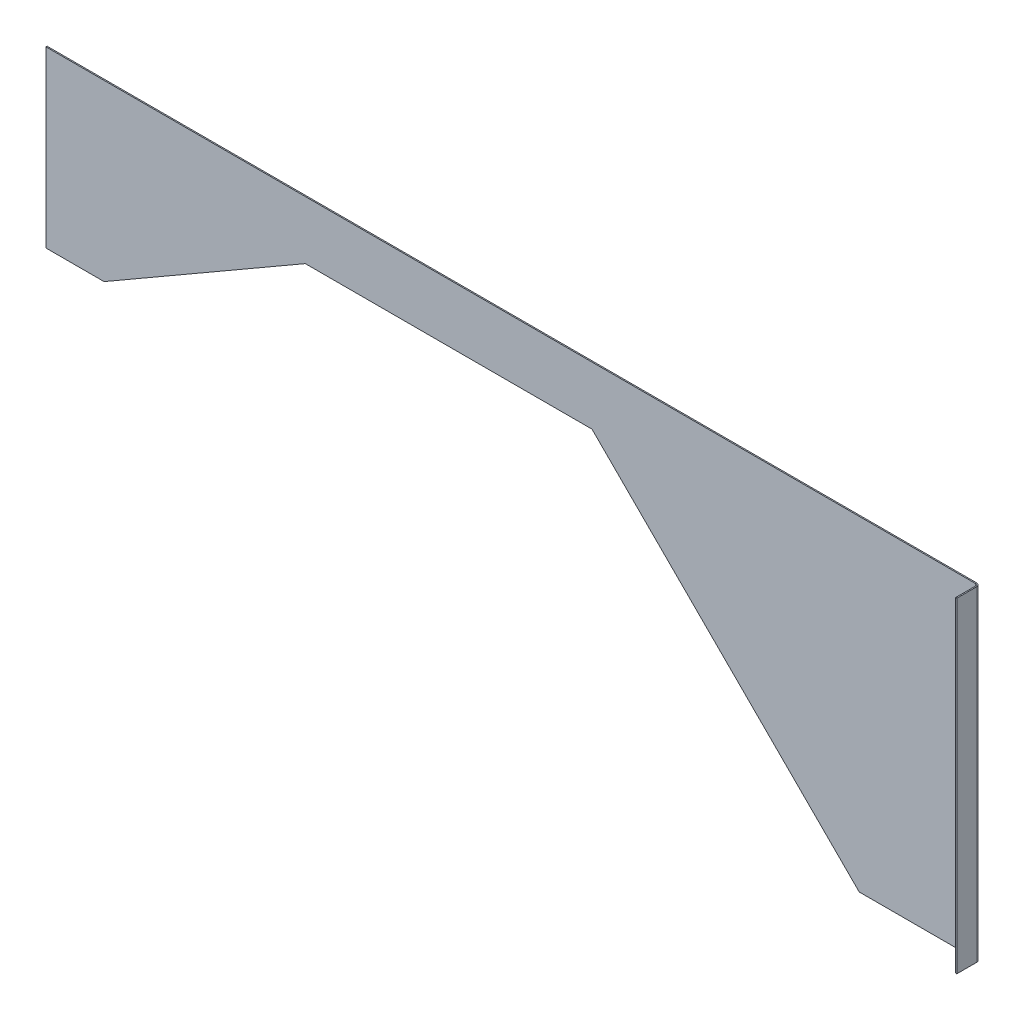
ISO-10303-21;
HEADER;
FILE_DESCRIPTION(('STEP AP214'),'2;1');
FILE_NAME('part.step','',(''),(''),'','','');
FILE_SCHEMA(('AUTOMOTIVE_DESIGN { 1 0 10303 214 1 1 1 1 }'));
ENDSEC;
DATA;
#1=APPLICATION_CONTEXT('core data for automotive mechanical design processes');
#2=APPLICATION_PROTOCOL_DEFINITION('international standard','automotive_design',2000,#1);
#3=PRODUCT_CONTEXT('',#1,'mechanical');
#4=PRODUCT('Part','Part','',(#3));
#5=PRODUCT_RELATED_PRODUCT_CATEGORY('part','',(#4));
#6=PRODUCT_DEFINITION_FORMATION('','',#4);
#7=PRODUCT_DEFINITION_CONTEXT('part definition',#1,'design');
#8=PRODUCT_DEFINITION('design','',#6,#7);
#9=PRODUCT_DEFINITION_SHAPE('','',#8);
#10=(LENGTH_UNIT() NAMED_UNIT(*) SI_UNIT(.MILLI.,.METRE.));
#11=(NAMED_UNIT(*) PLANE_ANGLE_UNIT() SI_UNIT($,.RADIAN.));
#12=(NAMED_UNIT(*) SI_UNIT($,.STERADIAN.) SOLID_ANGLE_UNIT());
#13=UNCERTAINTY_MEASURE_WITH_UNIT(LENGTH_MEASURE(1.E-05),#10,'distance_accuracy_value','');
#14=(GEOMETRIC_REPRESENTATION_CONTEXT(3) GLOBAL_UNCERTAINTY_ASSIGNED_CONTEXT((#13)) GLOBAL_UNIT_ASSIGNED_CONTEXT((#10,
#11,#12)) REPRESENTATION_CONTEXT('',''));
#15=CARTESIAN_POINT('',(0.,0.,0.));
#16=DIRECTION('',(0.,0.,1.));
#17=DIRECTION('',(1.,0.,0.));
#18=AXIS2_PLACEMENT_3D('',#15,#16,#17);
#19=CARTESIAN_POINT('',(-470.000000000001,-100.,1.));
#20=DIRECTION('',(0.,-1.,0.));
#21=DIRECTION('',(1.,0.,0.));
#22=AXIS2_PLACEMENT_3D('',#19,#20,#21);
#23=PLANE('',#22);
#24=DIRECTION('',(0.,0.,1.));
#25=VECTOR('',#24,1.);
#26=CARTESIAN_POINT('',(-470.000000000001,-100.,1.));
#27=LINE('',#26,#25);
#28=CARTESIAN_POINT('',(-470.000000000001,-100.,1.));
#29=VERTEX_POINT('',#28);
#30=CARTESIAN_POINT('',(-470.000000000001,-100.,2.));
#31=VERTEX_POINT('',#30);
#32=EDGE_CURVE('E13',#29,#31,#27,.T.);
#33=ORIENTED_EDGE('',*,*,#32,.F.);
#34=DIRECTION('',(1.,0.,0.));
#35=VECTOR('',#34,1.);
#36=CARTESIAN_POINT('',(-470.000000000001,-100.,1.));
#37=LINE('',#36,#35);
#38=CARTESIAN_POINT('',(-420.000000000001,-100.,1.));
#39=VERTEX_POINT('',#38);
#40=EDGE_CURVE('E198',#29,#39,#37,.T.);
#41=ORIENTED_EDGE('',*,*,#40,.T.);
#42=DIRECTION('',(0.,0.,1.));
#43=VECTOR('',#42,1.);
#44=CARTESIAN_POINT('',(-420.000000000001,-100.,1.));
#45=LINE('',#44,#43);
#46=CARTESIAN_POINT('',(-420.000000000001,-100.,2.));
#47=VERTEX_POINT('',#46);
#48=EDGE_CURVE('E69',#39,#47,#45,.T.);
#49=ORIENTED_EDGE('',*,*,#48,.T.);
#50=DIRECTION('',(1.,0.,0.));
#51=VECTOR('',#50,1.);
#52=CARTESIAN_POINT('',(0.,-100.,2.));
#53=LINE('',#52,#51);
#54=EDGE_CURVE('E191',#31,#47,#53,.T.);
#55=ORIENTED_EDGE('',*,*,#54,.F.);
#56=EDGE_LOOP('',(#33,#41,#49,#55));
#57=FACE_BOUND('',#56,.T.);
#58=ADVANCED_FACE('F59',(#57),#23,.T.);
#59=CARTESIAN_POINT('',(-420.000000000001,-100.,1.));
#60=DIRECTION('',(0.500000000000002,-0.866025403784438,0.));
#61=DIRECTION('',(0.866025403784438,0.500000000000001,0.));
#62=AXIS2_PLACEMENT_3D('',#59,#60,#61);
#63=PLANE('',#62);
#64=ORIENTED_EDGE('',*,*,#48,.F.);
#65=DIRECTION('',(0.866025403784438,0.500000000000001,0.));
#66=VECTOR('',#65,1.);
#67=CARTESIAN_POINT('',(-420.000000000001,-100.,1.));
#68=LINE('',#67,#66);
#69=CARTESIAN_POINT('',(-246.794919243114,0.,1.));
#70=VERTEX_POINT('',#69);
#71=EDGE_CURVE('E201',#39,#70,#68,.T.);
#72=ORIENTED_EDGE('',*,*,#71,.T.);
#73=DIRECTION('',(0.,0.,1.));
#74=VECTOR('',#73,1.);
#75=CARTESIAN_POINT('',(-246.794919243114,0.,1.));
#76=LINE('',#75,#74);
#77=CARTESIAN_POINT('',(-246.794919243114,0.,2.));
#78=VERTEX_POINT('',#77);
#79=EDGE_CURVE('E213',#70,#78,#76,.T.);
#80=ORIENTED_EDGE('',*,*,#79,.T.);
#81=DIRECTION('',(0.866025403784438,0.500000000000001,0.));
#82=VECTOR('',#81,1.);
#83=CARTESIAN_POINT('',(-420.000000000001,-100.,2.));
#84=LINE('',#83,#82);
#85=EDGE_CURVE('E188',#47,#78,#84,.T.);
#86=ORIENTED_EDGE('',*,*,#85,.F.);
#87=EDGE_LOOP('',(#64,#72,#80,#86));
#88=FACE_BOUND('',#87,.T.);
#89=ADVANCED_FACE('F225',(#88),#63,.T.);
#90=CARTESIAN_POINT('',(-246.794919243114,0.,1.));
#91=DIRECTION('',(0.,-1.,0.));
#92=DIRECTION('',(1.,0.,0.));
#93=AXIS2_PLACEMENT_3D('',#90,#91,#92);
#94=PLANE('',#93);
#95=ORIENTED_EDGE('',*,*,#79,.F.);
#96=DIRECTION('',(1.,0.,0.));
#97=VECTOR('',#96,1.);
#98=CARTESIAN_POINT('',(-246.794919243114,0.,1.));
#99=LINE('',#98,#97);
#100=CARTESIAN_POINT('',(0.,0.,1.));
#101=VERTEX_POINT('',#100);
#102=EDGE_CURVE('E204',#70,#101,#99,.T.);
#103=ORIENTED_EDGE('',*,*,#102,.T.);
#104=DIRECTION('',(0.,0.,1.));
#105=VECTOR('',#104,1.);
#106=CARTESIAN_POINT('',(0.,0.,1.));
#107=LINE('',#106,#105);
#108=CARTESIAN_POINT('',(0.,0.,2.));
#109=VERTEX_POINT('',#108);
#110=EDGE_CURVE('E211',#101,#109,#107,.T.);
#111=ORIENTED_EDGE('',*,*,#110,.T.);
#112=DIRECTION('',(1.,0.,0.));
#113=VECTOR('',#112,1.);
#114=CARTESIAN_POINT('',(0.,0.,2.));
#115=LINE('',#114,#113);
#116=EDGE_CURVE('E185',#78,#109,#115,.T.);
#117=ORIENTED_EDGE('',*,*,#116,.F.);
#118=EDGE_LOOP('',(#95,#103,#111,#117));
#119=FACE_BOUND('',#118,.T.);
#120=ADVANCED_FACE('F228',(#119),#94,.T.);
#121=CARTESIAN_POINT('',(0.,0.,1.));
#122=DIRECTION('',(-0.707106781186549,-0.707106781186546,0.));
#123=DIRECTION('',(0.707106781186546,-0.707106781186549,0.));
#124=AXIS2_PLACEMENT_3D('',#121,#122,#123);
#125=PLANE('',#124);
#126=ORIENTED_EDGE('',*,*,#110,.F.);
#127=DIRECTION('',(0.707106781186546,-0.707106781186549,0.));
#128=VECTOR('',#127,1.);
#129=CARTESIAN_POINT('',(0.,0.,1.));
#130=LINE('',#129,#128);
#131=CARTESIAN_POINT('',(229.999999999999,-230.,1.));
#132=VERTEX_POINT('',#131);
#133=EDGE_CURVE('E133',#101,#132,#130,.T.);
#134=ORIENTED_EDGE('',*,*,#133,.T.);
#135=DIRECTION('',(0.,0.,1.));
#136=VECTOR('',#135,1.);
#137=CARTESIAN_POINT('',(229.999999999999,-230.,1.));
#138=LINE('',#137,#136);
#139=CARTESIAN_POINT('',(229.999999999999,-230.,2.));
#140=VERTEX_POINT('',#139);
#141=EDGE_CURVE('E121',#132,#140,#138,.T.);
#142=ORIENTED_EDGE('',*,*,#141,.T.);
#143=DIRECTION('',(0.707106781186546,-0.707106781186549,0.));
#144=VECTOR('',#143,1.);
#145=CARTESIAN_POINT('',(0.,0.,2.));
#146=LINE('',#145,#144);
#147=EDGE_CURVE('E182',#109,#140,#146,.T.);
#148=ORIENTED_EDGE('',*,*,#147,.F.);
#149=EDGE_LOOP('',(#126,#134,#142,#148));
#150=FACE_BOUND('',#149,.T.);
#151=ADVANCED_FACE('F230',(#150),#125,.T.);
#152=CARTESIAN_POINT('',(229.999999999999,-230.,1.));
#153=DIRECTION('',(0.,-1.,0.));
#154=DIRECTION('',(1.,0.,0.));
#155=AXIS2_PLACEMENT_3D('',#152,#153,#154);
#156=PLANE('',#155);
#157=ORIENTED_EDGE('',*,*,#141,.F.);
#158=DIRECTION('',(1.,0.,0.));
#159=VECTOR('',#158,1.);
#160=CARTESIAN_POINT('',(229.999999999999,-230.,1.));
#161=LINE('',#160,#159);
#162=CARTESIAN_POINT('',(329.999999999999,-230.,1.));
#163=VERTEX_POINT('',#162);
#164=EDGE_CURVE('E123',#132,#163,#161,.T.);
#165=ORIENTED_EDGE('',*,*,#164,.T.);
#166=DIRECTION('',(0.,0.,1.));
#167=VECTOR('',#166,1.);
#168=CARTESIAN_POINT('',(329.999999999999,-230.,1.));
#169=LINE('',#168,#167);
#170=CARTESIAN_POINT('',(329.999999999999,-230.,2.));
#171=VERTEX_POINT('',#170);
#172=EDGE_CURVE('E127',#163,#171,#169,.T.);
#173=ORIENTED_EDGE('',*,*,#172,.T.);
#174=DIRECTION('',(1.,0.,0.));
#175=VECTOR('',#174,1.);
#176=CARTESIAN_POINT('',(0.,-230.,2.));
#177=LINE('',#176,#175);
#178=EDGE_CURVE('E180',#140,#171,#177,.T.);
#179=ORIENTED_EDGE('',*,*,#178,.F.);
#180=EDGE_LOOP('',(#157,#165,#173,#179));
#181=FACE_BOUND('',#180,.T.);
#182=ADVANCED_FACE('F125',(#181),#156,.T.);
#183=CARTESIAN_POINT('',(329.999999999999,50.,1.));
#184=DIRECTION('',(0.,1.,0.));
#185=DIRECTION('',(-1.,0.,0.));
#186=AXIS2_PLACEMENT_3D('',#183,#184,#185);
#187=PLANE('',#186);
#188=DIRECTION('',(0.,0.,1.));
#189=VECTOR('',#188,1.);
#190=CARTESIAN_POINT('',(329.999999999999,50.,1.));
#191=LINE('',#190,#189);
#192=CARTESIAN_POINT('',(329.999999999999,50.,1.00000000000001));
#193=VERTEX_POINT('',#192);
#194=CARTESIAN_POINT('',(329.999999999999,50.,2.));
#195=VERTEX_POINT('',#194);
#196=EDGE_CURVE('E156',#193,#195,#191,.T.);
#197=ORIENTED_EDGE('',*,*,#196,.F.);
#198=DIRECTION('',(-1.,0.,0.));
#199=VECTOR('',#198,1.);
#200=CARTESIAN_POINT('',(329.999999999999,50.,1.));
#201=LINE('',#200,#199);
#202=CARTESIAN_POINT('',(-470.000000000001,49.9999999999999,1.));
#203=VERTEX_POINT('',#202);
#204=EDGE_CURVE('E140',#193,#203,#201,.T.);
#205=ORIENTED_EDGE('',*,*,#204,.T.);
#206=DIRECTION('',(0.,0.,1.));
#207=VECTOR('',#206,1.);
#208=CARTESIAN_POINT('',(-470.000000000001,49.9999999999999,1.));
#209=LINE('',#208,#207);
#210=CARTESIAN_POINT('',(-470.000000000001,49.9999999999999,2.));
#211=VERTEX_POINT('',#210);
#212=EDGE_CURVE('E63',#203,#211,#209,.T.);
#213=ORIENTED_EDGE('',*,*,#212,.T.);
#214=DIRECTION('',(1.,0.,0.));
#215=VECTOR('',#214,1.);
#216=CARTESIAN_POINT('',(0.,50.,2.));
#217=LINE('',#216,#215);
#218=EDGE_CURVE('E77',#195,#211,#217,.F.);
#219=ORIENTED_EDGE('',*,*,#218,.F.);
#220=EDGE_LOOP('',(#197,#205,#213,#219));
#221=FACE_BOUND('',#220,.T.);
#222=ADVANCED_FACE('F319',(#221),#187,.T.);
#223=CARTESIAN_POINT('',(-470.000000000001,49.9999999999999,1.));
#224=DIRECTION('',(-1.,0.,0.));
#225=DIRECTION('',(0.,-1.,0.));
#226=AXIS2_PLACEMENT_3D('',#223,#224,#225);
#227=PLANE('',#226);
#228=DIRECTION('',(0.,-1.,0.));
#229=VECTOR('',#228,1.);
#230=CARTESIAN_POINT('',(-470.000000000001,49.9999999999999,1.));
#231=LINE('',#230,#229);
#232=EDGE_CURVE('E164',#203,#29,#231,.T.);
#233=ORIENTED_EDGE('',*,*,#232,.T.);
#234=ORIENTED_EDGE('',*,*,#32,.T.);
#235=DIRECTION('',(0.,1.,0.));
#236=VECTOR('',#235,1.);
#237=CARTESIAN_POINT('',(-470.000000000001,0.,2.));
#238=LINE('',#237,#236);
#239=EDGE_CURVE('E177',#211,#31,#238,.F.);
#240=ORIENTED_EDGE('',*,*,#239,.F.);
#241=ORIENTED_EDGE('',*,*,#212,.F.);
#242=EDGE_LOOP('',(#233,#234,#240,#241));
#243=FACE_BOUND('',#242,.T.);
#244=ADVANCED_FACE('F61',(#243),#227,.T.);
#245=CARTESIAN_POINT('',(0.,0.,2.));
#246=DIRECTION('',(0.,0.,1.));
#247=DIRECTION('',(1.,0.,0.));
#248=AXIS2_PLACEMENT_3D('',#245,#246,#247);
#249=PLANE('',#248);
#250=ORIENTED_EDGE('',*,*,#218,.T.);
#251=ORIENTED_EDGE('',*,*,#239,.T.);
#252=ORIENTED_EDGE('',*,*,#54,.T.);
#253=ORIENTED_EDGE('',*,*,#85,.T.);
#254=ORIENTED_EDGE('',*,*,#116,.T.);
#255=ORIENTED_EDGE('',*,*,#147,.T.);
#256=ORIENTED_EDGE('',*,*,#178,.T.);
#257=DIRECTION('',(0.,1.,0.));
#258=VECTOR('',#257,1.);
#259=CARTESIAN_POINT('',(329.999999999999,0.,2.));
#260=LINE('',#259,#258);
#261=EDGE_CURVE('E178',#171,#195,#260,.T.);
#262=ORIENTED_EDGE('',*,*,#261,.T.);
#263=EDGE_LOOP('',(#250,#251,#252,#253,#254,#255,#256,#262));
#264=FACE_BOUND('',#263,.T.);
#265=ADVANCED_FACE('F222',(#264),#249,.T.);
#266=CARTESIAN_POINT('',(0.,0.,1.));
#267=DIRECTION('',(0.,0.,1.));
#268=DIRECTION('',(1.,0.,0.));
#269=AXIS2_PLACEMENT_3D('',#266,#267,#268);
#270=PLANE('',#269);
#271=ORIENTED_EDGE('',*,*,#204,.F.);
#272=DIRECTION('',(0.,1.,0.));
#273=VECTOR('',#272,1.);
#274=CARTESIAN_POINT('',(329.999999999999,-230.,1.));
#275=LINE('',#274,#273);
#276=EDGE_CURVE('E132',#163,#193,#275,.T.);
#277=ORIENTED_EDGE('',*,*,#276,.F.);
#278=ORIENTED_EDGE('',*,*,#164,.F.);
#279=ORIENTED_EDGE('',*,*,#133,.F.);
#280=ORIENTED_EDGE('',*,*,#102,.F.);
#281=ORIENTED_EDGE('',*,*,#71,.F.);
#282=ORIENTED_EDGE('',*,*,#40,.F.);
#283=ORIENTED_EDGE('',*,*,#232,.F.);
#284=EDGE_LOOP('',(#271,#277,#278,#279,#280,#281,#282,#283));
#285=FACE_BOUND('',#284,.T.);
#286=ADVANCED_FACE('F137',(#285),#270,.F.);
#287=CARTESIAN_POINT('',(329.999999999999,-230.,4.00000000000001));
#288=DIRECTION('',(0.,-1.,0.));
#289=DIRECTION('',(0.,0.,-1.));
#290=AXIS2_PLACEMENT_3D('',#287,#288,#289);
#291=PLANE('',#290);
#292=DIRECTION('',(-1.,0.,0.));
#293=VECTOR('',#292,1.);
#294=CARTESIAN_POINT('',(332.999999999999,-230.,4.));
#295=LINE('',#294,#293);
#296=CARTESIAN_POINT('',(331.999999999999,-230.,4.));
#297=VERTEX_POINT('',#296);
#298=CARTESIAN_POINT('',(332.999999999999,-230.,4.));
#299=VERTEX_POINT('',#298);
#300=EDGE_CURVE('E168',#297,#299,#295,.F.);
#301=ORIENTED_EDGE('',*,*,#300,.F.);
#302=CARTESIAN_POINT('',(329.999999999999,-230.,4.00000000000001));
#303=DIRECTION('',(0.,1.,0.));
#304=DIRECTION('',(0.,0.,1.));
#305=AXIS2_PLACEMENT_3D('',#302,#303,#304);
#306=CIRCLE('',#305,2.);
#307=EDGE_CURVE('E155',#171,#297,#306,.F.);
#308=ORIENTED_EDGE('',*,*,#307,.F.);
#309=ORIENTED_EDGE('',*,*,#172,.F.);
#310=CARTESIAN_POINT('',(329.999999999999,-230.,4.00000000000001));
#311=DIRECTION('',(0.,1.,0.));
#312=DIRECTION('',(0.,0.,1.));
#313=AXIS2_PLACEMENT_3D('',#310,#311,#312);
#314=CIRCLE('',#313,3.);
#315=EDGE_CURVE('E152',#163,#299,#314,.F.);
#316=ORIENTED_EDGE('',*,*,#315,.T.);
#317=EDGE_LOOP('',(#301,#308,#309,#316));
#318=FACE_BOUND('',#317,.T.);
#319=ADVANCED_FACE('F150',(#318),#291,.T.);
#320=CARTESIAN_POINT('',(329.999999999999,50.,4.00000000000001));
#321=DIRECTION('',(0.,-1.,0.));
#322=DIRECTION('',(0.,0.,-1.));
#323=AXIS2_PLACEMENT_3D('',#320,#321,#322);
#324=PLANE('',#323);
#325=CARTESIAN_POINT('',(329.999999999999,50.,4.00000000000001));
#326=DIRECTION('',(0.,1.,0.));
#327=DIRECTION('',(0.,0.,1.));
#328=AXIS2_PLACEMENT_3D('',#325,#326,#327);
#329=CIRCLE('',#328,2.);
#330=CARTESIAN_POINT('',(331.999999999999,50.,4.));
#331=VERTEX_POINT('',#330);
#332=EDGE_CURVE('E172',#331,#195,#329,.T.);
#333=ORIENTED_EDGE('',*,*,#332,.F.);
#334=DIRECTION('',(-1.,0.,0.));
#335=VECTOR('',#334,1.);
#336=CARTESIAN_POINT('',(331.999999999999,50.,4.));
#337=LINE('',#336,#335);
#338=CARTESIAN_POINT('',(332.999999999999,50.,4.));
#339=VERTEX_POINT('',#338);
#340=EDGE_CURVE('E245',#331,#339,#337,.F.);
#341=ORIENTED_EDGE('',*,*,#340,.T.);
#342=CARTESIAN_POINT('',(329.999999999999,50.,4.00000000000001));
#343=DIRECTION('',(0.,1.,0.));
#344=DIRECTION('',(0.,0.,1.));
#345=AXIS2_PLACEMENT_3D('',#342,#343,#344);
#346=CIRCLE('',#345,3.);
#347=EDGE_CURVE('E162',#339,#193,#346,.T.);
#348=ORIENTED_EDGE('',*,*,#347,.T.);
#349=ORIENTED_EDGE('',*,*,#196,.T.);
#350=EDGE_LOOP('',(#333,#341,#348,#349));
#351=FACE_BOUND('',#350,.T.);
#352=ADVANCED_FACE('F243',(#351),#324,.F.);
#353=CARTESIAN_POINT('',(329.999999999999,50.,4.00000000000001));
#354=DIRECTION('',(0.,1.,0.));
#355=DIRECTION('',(1.,0.,0.));
#356=AXIS2_PLACEMENT_3D('',#353,#354,#355);
#357=CYLINDRICAL_SURFACE('',#356,3.);
#358=ORIENTED_EDGE('',*,*,#276,.T.);
#359=ORIENTED_EDGE('',*,*,#347,.F.);
#360=DIRECTION('',(0.,1.,0.));
#361=VECTOR('',#360,1.);
#362=CARTESIAN_POINT('',(332.999999999999,-230.,4.));
#363=LINE('',#362,#361);
#364=EDGE_CURVE('E161',#339,#299,#363,.F.);
#365=ORIENTED_EDGE('',*,*,#364,.T.);
#366=ORIENTED_EDGE('',*,*,#315,.F.);
#367=EDGE_LOOP('',(#358,#359,#365,#366));
#368=FACE_BOUND('',#367,.T.);
#369=ADVANCED_FACE('F159',(#368),#357,.T.);
#370=CARTESIAN_POINT('',(329.999999999999,50.,4.00000000000001));
#371=DIRECTION('',(0.,1.,0.));
#372=DIRECTION('',(1.,0.,0.));
#373=AXIS2_PLACEMENT_3D('',#370,#371,#372);
#374=CYLINDRICAL_SURFACE('',#373,2.);
#375=ORIENTED_EDGE('',*,*,#261,.F.);
#376=ORIENTED_EDGE('',*,*,#307,.T.);
#377=DIRECTION('',(0.,1.,0.));
#378=VECTOR('',#377,1.);
#379=CARTESIAN_POINT('',(331.999999999999,-230.,4.));
#380=LINE('',#379,#378);
#381=EDGE_CURVE('E239',#297,#331,#380,.T.);
#382=ORIENTED_EDGE('',*,*,#381,.T.);
#383=ORIENTED_EDGE('',*,*,#332,.T.);
#384=EDGE_LOOP('',(#375,#376,#382,#383));
#385=FACE_BOUND('',#384,.T.);
#386=ADVANCED_FACE('F234',(#385),#374,.F.);
#387=CARTESIAN_POINT('',(332.999999999999,-230.,2.));
#388=DIRECTION('',(0.,1.,0.));
#389=DIRECTION('',(0.,0.,1.));
#390=AXIS2_PLACEMENT_3D('',#387,#388,#389);
#391=PLANE('',#390);
#392=ORIENTED_EDGE('',*,*,#300,.T.);
#393=DIRECTION('',(0.,0.,-1.));
#394=VECTOR('',#393,1.);
#395=CARTESIAN_POINT('',(332.999999999999,-230.,-9.67632529039635E-13));
#396=LINE('',#395,#394);
#397=CARTESIAN_POINT('',(332.999999999999,-230.,21.));
#398=VERTEX_POINT('',#397);
#399=EDGE_CURVE('E267',#398,#299,#396,.T.);
#400=ORIENTED_EDGE('',*,*,#399,.F.);
#401=DIRECTION('',(-1.,0.,0.));
#402=VECTOR('',#401,1.);
#403=CARTESIAN_POINT('',(332.999999999999,-230.,21.));
#404=LINE('',#403,#402);
#405=CARTESIAN_POINT('',(331.999999999999,-230.,21.));
#406=VERTEX_POINT('',#405);
#407=EDGE_CURVE('E288',#398,#406,#404,.T.);
#408=ORIENTED_EDGE('',*,*,#407,.T.);
#409=DIRECTION('',(0.,0.,1.));
#410=VECTOR('',#409,1.);
#411=CARTESIAN_POINT('',(331.999999999999,-230.,2.));
#412=LINE('',#411,#410);
#413=EDGE_CURVE('E265',#406,#297,#412,.F.);
#414=ORIENTED_EDGE('',*,*,#413,.T.);
#415=EDGE_LOOP('',(#392,#400,#408,#414));
#416=FACE_BOUND('',#415,.T.);
#417=ADVANCED_FACE('F275',(#416),#391,.F.);
#418=CARTESIAN_POINT('',(332.999999999999,50.0000000000001,21.));
#419=DIRECTION('',(0.,-1.,0.));
#420=DIRECTION('',(0.,0.,-1.));
#421=AXIS2_PLACEMENT_3D('',#418,#419,#420);
#422=PLANE('',#421);
#423=ORIENTED_EDGE('',*,*,#340,.F.);
#424=DIRECTION('',(0.,0.,-1.));
#425=VECTOR('',#424,1.);
#426=CARTESIAN_POINT('',(331.999999999999,50.0000000000001,21.));
#427=LINE('',#426,#425);
#428=CARTESIAN_POINT('',(331.999999999999,50.0000000000001,21.));
#429=VERTEX_POINT('',#428);
#430=EDGE_CURVE('E253',#331,#429,#427,.F.);
#431=ORIENTED_EDGE('',*,*,#430,.T.);
#432=DIRECTION('',(-1.,0.,0.));
#433=VECTOR('',#432,1.);
#434=CARTESIAN_POINT('',(332.999999999999,50.0000000000001,21.));
#435=LINE('',#434,#433);
#436=CARTESIAN_POINT('',(332.999999999999,50.0000000000001,21.));
#437=VERTEX_POINT('',#436);
#438=EDGE_CURVE('E175',#437,#429,#435,.T.);
#439=ORIENTED_EDGE('',*,*,#438,.F.);
#440=DIRECTION('',(0.,0.,1.));
#441=VECTOR('',#440,1.);
#442=CARTESIAN_POINT('',(332.999999999999,50.,-1.07719401173291E-12));
#443=LINE('',#442,#441);
#444=EDGE_CURVE('E256',#339,#437,#443,.T.);
#445=ORIENTED_EDGE('',*,*,#444,.F.);
#446=EDGE_LOOP('',(#423,#431,#439,#445));
#447=FACE_BOUND('',#446,.T.);
#448=ADVANCED_FACE('F250',(#447),#422,.F.);
#449=CARTESIAN_POINT('',(332.999999999999,0.,-9.67632529039635E-13));
#450=DIRECTION('',(-1.,0.,0.));
#451=DIRECTION('',(0.,0.,1.));
#452=AXIS2_PLACEMENT_3D('',#449,#450,#451);
#453=PLANE('',#452);
#454=ORIENTED_EDGE('',*,*,#364,.F.);
#455=ORIENTED_EDGE('',*,*,#444,.T.);
#456=DIRECTION('',(0.,-1.,0.));
#457=VECTOR('',#456,1.);
#458=CARTESIAN_POINT('',(332.999999999999,0.,21.));
#459=LINE('',#458,#457);
#460=EDGE_CURVE('E283',#437,#398,#459,.T.);
#461=ORIENTED_EDGE('',*,*,#460,.T.);
#462=ORIENTED_EDGE('',*,*,#399,.T.);
#463=EDGE_LOOP('',(#454,#455,#461,#462));
#464=FACE_BOUND('',#463,.T.);
#465=ADVANCED_FACE('F281',(#464),#453,.F.);
#466=CARTESIAN_POINT('',(331.999999999999,0.,-9.64141047700792E-13));
#467=DIRECTION('',(-1.,0.,0.));
#468=DIRECTION('',(0.,0.,1.));
#469=AXIS2_PLACEMENT_3D('',#466,#467,#468);
#470=PLANE('',#469);
#471=ORIENTED_EDGE('',*,*,#430,.F.);
#472=ORIENTED_EDGE('',*,*,#381,.F.);
#473=ORIENTED_EDGE('',*,*,#413,.F.);
#474=DIRECTION('',(0.,1.,0.));
#475=VECTOR('',#474,1.);
#476=CARTESIAN_POINT('',(331.999999999999,-230.,21.));
#477=LINE('',#476,#475);
#478=EDGE_CURVE('E264',#429,#406,#477,.F.);
#479=ORIENTED_EDGE('',*,*,#478,.F.);
#480=EDGE_LOOP('',(#471,#472,#473,#479));
#481=FACE_BOUND('',#480,.T.);
#482=ADVANCED_FACE('F260',(#481),#470,.T.);
#483=CARTESIAN_POINT('',(332.999999999999,-230.,21.));
#484=DIRECTION('',(0.,0.,-1.));
#485=DIRECTION('',(-1.,0.,0.));
#486=AXIS2_PLACEMENT_3D('',#483,#484,#485);
#487=PLANE('',#486);
#488=ORIENTED_EDGE('',*,*,#478,.T.);
#489=ORIENTED_EDGE('',*,*,#407,.F.);
#490=ORIENTED_EDGE('',*,*,#460,.F.);
#491=ORIENTED_EDGE('',*,*,#438,.T.);
#492=EDGE_LOOP('',(#488,#489,#490,#491));
#493=FACE_BOUND('',#492,.T.);
#494=ADVANCED_FACE('F291',(#493),#487,.F.);
#495=CLOSED_SHELL('',(#58,#89,#120,#151,#182,#222,#244,#265,#286,#319,#352,#369,#386,#417,#448,
#465,#482,#494));
#496=MANIFOLD_SOLID_BREP('B2',#495);
#497=ADVANCED_BREP_SHAPE_REPRESENTATION('',(#18,#496),#14);
#498=SHAPE_DEFINITION_REPRESENTATION(#9,#497);
ENDSEC;
END-ISO-10303-21;
